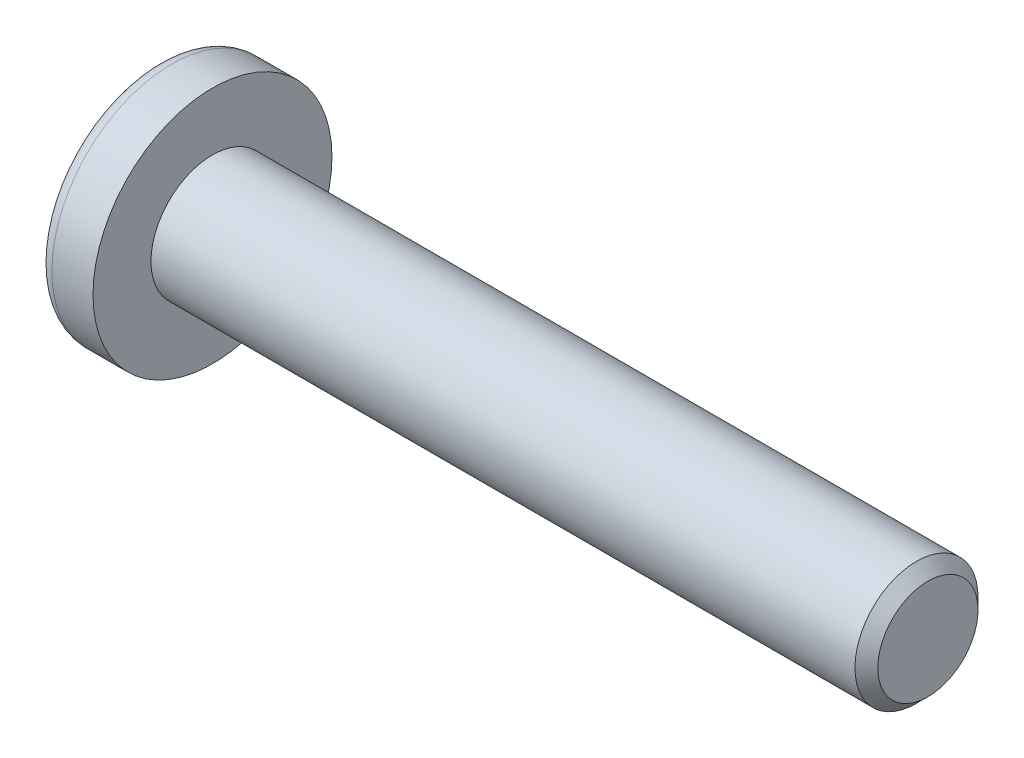
ISO-10303-21;
HEADER;
FILE_DESCRIPTION(('STEP AP214'),'2;1');
FILE_NAME('part.step','',(''),(''),'','','');
FILE_SCHEMA(('AUTOMOTIVE_DESIGN { 1 0 10303 214 1 1 1 1 }'));
ENDSEC;
DATA;
#1=APPLICATION_CONTEXT('core data for automotive mechanical design processes');
#2=APPLICATION_PROTOCOL_DEFINITION('international standard','automotive_design',2000,#1);
#3=PRODUCT_CONTEXT('',#1,'mechanical');
#4=PRODUCT('Part','Part','',(#3));
#5=PRODUCT_RELATED_PRODUCT_CATEGORY('part','',(#4));
#6=PRODUCT_DEFINITION_FORMATION('','',#4);
#7=PRODUCT_DEFINITION_CONTEXT('part definition',#1,'design');
#8=PRODUCT_DEFINITION('design','',#6,#7);
#9=PRODUCT_DEFINITION_SHAPE('','',#8);
#10=(LENGTH_UNIT() NAMED_UNIT(*) SI_UNIT(.MILLI.,.METRE.));
#11=(NAMED_UNIT(*) PLANE_ANGLE_UNIT() SI_UNIT($,.RADIAN.));
#12=(NAMED_UNIT(*) SI_UNIT($,.STERADIAN.) SOLID_ANGLE_UNIT());
#13=UNCERTAINTY_MEASURE_WITH_UNIT(LENGTH_MEASURE(1.E-05),#10,'distance_accuracy_value','');
#14=(GEOMETRIC_REPRESENTATION_CONTEXT(3) GLOBAL_UNCERTAINTY_ASSIGNED_CONTEXT((#13)) GLOBAL_UNIT_ASSIGNED_CONTEXT((#10,
#11,#12)) REPRESENTATION_CONTEXT('',''));
#15=CARTESIAN_POINT('',(0.,0.,0.));
#16=DIRECTION('',(0.,0.,1.));
#17=DIRECTION('',(1.,0.,0.));
#18=AXIS2_PLACEMENT_3D('',#15,#16,#17);
#19=CARTESIAN_POINT('',(3.49504,0.,0.));
#20=DIRECTION('',(-1.,0.,0.));
#21=DIRECTION('',(0.,1.,0.));
#22=AXIS2_PLACEMENT_3D('',#19,#20,#21);
#23=SPHERICAL_SURFACE('',#22,3.49504);
#24=CARTESIAN_POINT('',(0.638066947960321,0.,0.));
#25=DIRECTION('',(-1.,0.,0.));
#26=DIRECTION('',(0.,0.,1.));
#27=AXIS2_PLACEMENT_3D('',#24,#25,#26);
#28=CIRCLE('',#27,2.01320877742947);
#29=CARTESIAN_POINT('',(0.638066947960321,0.,2.01320877742947));
#30=VERTEX_POINT('',#29);
#31=EDGE_CURVE('E135',#30,#30,#28,.T.);
#32=ORIENTED_EDGE('',*,*,#31,.T.);
#33=EDGE_LOOP('',(#32));
#34=FACE_BOUND('',#33,.T.);
#35=CARTESIAN_POINT('',(3.48860800425343,-0.0562204072662827,0.));
#36=DIRECTION('',(-0.113665320353011,-0.99351909641891,0.));
#37=DIRECTION('',(0.99351909641891,-0.113665320353011,0.));
#38=AXIS2_PLACEMENT_3D('',#35,#36,#37);
#39=CIRCLE('',#38,3.49458187725478);
#40=CARTESIAN_POINT('',(0.227775025036725,0.316840992898337,1.19995665346604));
#41=VERTEX_POINT('',#40);
#42=CARTESIAN_POINT('',(0.033060362162214,0.339117670430593,0.339117670430593));
#43=VERTEX_POINT('',#42);
#44=EDGE_CURVE('E131',#41,#43,#39,.T.);
#45=ORIENTED_EDGE('',*,*,#44,.F.);
#46=CARTESIAN_POINT('',(2.78874832810788,0.,-0.872695468934767));
#47=DIRECTION('',(0.629103472698606,0.,0.777321568360582));
#48=DIRECTION('',(0.777321568360582,0.,-0.629103472698606));
#49=AXIS2_PLACEMENT_3D('',#46,#47,#48);
#50=CIRCLE('',#49,3.30981257691679);
#51=CARTESIAN_POINT('',(0.227775025036724,-0.316840992898345,1.19995665346604));
#52=VERTEX_POINT('',#51);
#53=EDGE_CURVE('E123',#41,#52,#50,.T.);
#54=ORIENTED_EDGE('',*,*,#53,.T.);
#55=CARTESIAN_POINT('',(3.48860800425343,0.0562204072662818,0.));
#56=DIRECTION('',(-0.11366532035301,0.99351909641891,0.));
#57=DIRECTION('',(-0.99351909641891,-0.11366532035301,0.));
#58=AXIS2_PLACEMENT_3D('',#55,#56,#57);
#59=CIRCLE('',#58,3.49458187725478);
#60=CARTESIAN_POINT('',(0.0330603621622127,-0.339117670430595,0.339117670430594));
#61=VERTEX_POINT('',#60);
#62=EDGE_CURVE('E374',#61,#52,#59,.T.);
#63=ORIENTED_EDGE('',*,*,#62,.F.);
#64=CARTESIAN_POINT('',(3.48860800425343,0.,-0.0562204072662819));
#65=DIRECTION('',(-0.11366532035301,0.,-0.99351909641891));
#66=DIRECTION('',(-0.99351909641891,0.,0.11366532035301));
#67=AXIS2_PLACEMENT_3D('',#64,#65,#66);
#68=CIRCLE('',#67,3.49458187725478);
#69=CARTESIAN_POINT('',(0.227775025036724,-1.19995665346604,0.316840992898341));
#70=VERTEX_POINT('',#69);
#71=EDGE_CURVE('E169',#70,#61,#68,.T.);
#72=ORIENTED_EDGE('',*,*,#71,.F.);
#73=CARTESIAN_POINT('',(2.78874832810788,0.872695468934764,0.));
#74=DIRECTION('',(0.629103472698606,-0.777321568360582,0.));
#75=DIRECTION('',(0.777321568360582,0.629103472698606,0.));
#76=AXIS2_PLACEMENT_3D('',#73,#74,#75);
#77=CIRCLE('',#76,3.30981257691679);
#78=CARTESIAN_POINT('',(0.227775025036722,-1.19995665346604,-0.316840992898341));
#79=VERTEX_POINT('',#78);
#80=EDGE_CURVE('E165',#70,#79,#77,.T.);
#81=ORIENTED_EDGE('',*,*,#80,.T.);
#82=CARTESIAN_POINT('',(3.48860800425343,0.,0.0562204072662826));
#83=DIRECTION('',(-0.113665320353011,0.,0.99351909641891));
#84=DIRECTION('',(0.99351909641891,0.,0.113665320353011));
#85=AXIS2_PLACEMENT_3D('',#82,#83,#84);
#86=CIRCLE('',#85,3.49458187725478);
#87=CARTESIAN_POINT('',(0.0330603621622127,-0.339117670430592,-0.339117670430594));
#88=VERTEX_POINT('',#87);
#89=EDGE_CURVE('E49',#88,#79,#86,.T.);
#90=ORIENTED_EDGE('',*,*,#89,.F.);
#91=CARTESIAN_POINT('',(0.227775025036724,-0.316840992898336,-1.19995665346604));
#92=VERTEX_POINT('',#91);
#93=EDGE_CURVE('E372',#92,#88,#59,.T.);
#94=ORIENTED_EDGE('',*,*,#93,.F.);
#95=CARTESIAN_POINT('',(2.78874832810788,0.,0.872695468934766));
#96=DIRECTION('',(0.629103472698606,0.,-0.777321568360582));
#97=DIRECTION('',(-0.777321568360582,0.,-0.629103472698606));
#98=AXIS2_PLACEMENT_3D('',#95,#96,#97);
#99=CIRCLE('',#98,3.30981257691679);
#100=CARTESIAN_POINT('',(0.227775025036724,0.316840992898345,-1.19995665346604));
#101=VERTEX_POINT('',#100);
#102=EDGE_CURVE('E379',#92,#101,#99,.T.);
#103=ORIENTED_EDGE('',*,*,#102,.T.);
#104=CARTESIAN_POINT('',(0.033060362162214,0.339117670430595,-0.339117670430594));
#105=VERTEX_POINT('',#104);
#106=EDGE_CURVE('E108',#105,#101,#39,.T.);
#107=ORIENTED_EDGE('',*,*,#106,.F.);
#108=CARTESIAN_POINT('',(0.227775025036726,1.19995665346604,-0.316840992898341));
#109=VERTEX_POINT('',#108);
#110=EDGE_CURVE('E130',#109,#105,#86,.T.);
#111=ORIENTED_EDGE('',*,*,#110,.F.);
#112=CARTESIAN_POINT('',(2.78874832810788,-0.872695468934769,0.));
#113=DIRECTION('',(0.629103472698606,0.777321568360582,0.));
#114=DIRECTION('',(-0.777321568360582,0.629103472698606,0.));
#115=AXIS2_PLACEMENT_3D('',#112,#113,#114);
#116=CIRCLE('',#115,3.30981257691679);
#117=CARTESIAN_POINT('',(0.227775025036726,1.19995665346604,0.31684099289834));
#118=VERTEX_POINT('',#117);
#119=EDGE_CURVE('E57',#109,#118,#116,.T.);
#120=ORIENTED_EDGE('',*,*,#119,.T.);
#121=EDGE_CURVE('E168',#43,#118,#68,.T.);
#122=ORIENTED_EDGE('',*,*,#121,.F.);
#123=EDGE_LOOP('',(#45,#54,#63,#72,#81,#90,#94,#103,#107,#111,#120,#122));
#124=FACE_BOUND('',#123,.T.);
#125=ADVANCED_FACE('F34',(#34,#124),#23,.T.);
#126=CARTESIAN_POINT('',(1.71044397905759,0.,-0.147213612565445));
#127=DIRECTION('',(-0.113665320353011,0.,0.99351909641891));
#128=DIRECTION('',(0.99351909641891,0.,0.113665320353011));
#129=AXIS2_PLACEMENT_3D('',#126,#127,#128);
#130=PLANE('',#129);
#131=ORIENTED_EDGE('',*,*,#110,.T.);
#132=DIRECTION('',(0.987162587649563,-0.112938092654823,0.112938092654823));
#133=VECTOR('',#132,1.);
#134=CARTESIAN_POINT('',(1.72685656853982,0.145335901056886,-0.145335901056885));
#135=LINE('',#134,#133);
#136=CARTESIAN_POINT('',(1.4986,0.171450000000001,-0.17145));
#137=VERTEX_POINT('',#136);
#138=EDGE_CURVE('E106',#105,#137,#135,.T.);
#139=ORIENTED_EDGE('',*,*,#138,.T.);
#140=DIRECTION('',(0.774265880811046,-0.626630437436058,0.0885812660249925));
#141=VECTOR('',#140,1.);
#142=CARTESIAN_POINT('',(0.,1.3843,-0.3429));
#143=LINE('',#142,#141);
#144=EDGE_CURVE('E128',#109,#137,#143,.T.);
#145=ORIENTED_EDGE('',*,*,#144,.F.);
#146=EDGE_LOOP('',(#131,#139,#145));
#147=FACE_BOUND('',#146,.T.);
#148=ADVANCED_FACE('F127',(#147),#130,.T.);
#149=DIRECTION('',(0.774265880811046,0.626630437436058,0.0885812660249925));
#150=VECTOR('',#149,1.);
#151=CARTESIAN_POINT('',(0.,-1.3843,-0.3429));
#152=LINE('',#151,#150);
#153=CARTESIAN_POINT('',(1.4986,-0.17145,-0.17145));
#154=VERTEX_POINT('',#153);
#155=EDGE_CURVE('E150',#79,#154,#152,.T.);
#156=ORIENTED_EDGE('',*,*,#155,.T.);
#157=DIRECTION('',(-0.987162587649563,-0.112938092654822,-0.112938092654823));
#158=VECTOR('',#157,1.);
#159=CARTESIAN_POINT('',(1.72685656853982,-0.145335901056885,-0.145335901056885));
#160=LINE('',#159,#158);
#161=EDGE_CURVE('E363',#154,#88,#160,.T.);
#162=ORIENTED_EDGE('',*,*,#161,.T.);
#163=ORIENTED_EDGE('',*,*,#89,.T.);
#164=EDGE_LOOP('',(#156,#162,#163));
#165=FACE_BOUND('',#164,.T.);
#166=ADVANCED_FACE('F198',(#165),#130,.T.);
#167=CARTESIAN_POINT('',(1.71044397905759,0.,0.147213612565445));
#168=DIRECTION('',(-0.11366532035301,0.,-0.99351909641891));
#169=DIRECTION('',(-0.99351909641891,0.,0.11366532035301));
#170=AXIS2_PLACEMENT_3D('',#167,#168,#169);
#171=PLANE('',#170);
#172=DIRECTION('',(0.774265880811046,-0.626630437436058,-0.0885812660249922));
#173=VECTOR('',#172,1.);
#174=CARTESIAN_POINT('',(0.,1.3843,0.342899999999999));
#175=LINE('',#174,#173);
#176=CARTESIAN_POINT('',(1.4986,0.17145,0.17145));
#177=VERTEX_POINT('',#176);
#178=EDGE_CURVE('E136',#118,#177,#175,.T.);
#179=ORIENTED_EDGE('',*,*,#178,.T.);
#180=DIRECTION('',(-0.987162587649563,0.112938092654822,0.112938092654822));
#181=VECTOR('',#180,1.);
#182=CARTESIAN_POINT('',(1.72685656853981,0.145335901056885,0.145335901056886));
#183=LINE('',#182,#181);
#184=EDGE_CURVE('E369',#177,#43,#183,.T.);
#185=ORIENTED_EDGE('',*,*,#184,.T.);
#186=ORIENTED_EDGE('',*,*,#121,.T.);
#187=EDGE_LOOP('',(#179,#185,#186));
#188=FACE_BOUND('',#187,.T.);
#189=ADVANCED_FACE('F229',(#188),#171,.T.);
#190=ORIENTED_EDGE('',*,*,#71,.T.);
#191=DIRECTION('',(0.987162587649563,0.112938092654823,-0.112938092654822));
#192=VECTOR('',#191,1.);
#193=CARTESIAN_POINT('',(1.72685656853982,-0.145335901056886,0.145335901056886));
#194=LINE('',#193,#192);
#195=CARTESIAN_POINT('',(1.4986,-0.171450000000001,0.171449999999999));
#196=VERTEX_POINT('',#195);
#197=EDGE_CURVE('E376',#61,#196,#194,.T.);
#198=ORIENTED_EDGE('',*,*,#197,.T.);
#199=DIRECTION('',(0.774265880811046,0.626630437436058,-0.0885812660249922));
#200=VECTOR('',#199,1.);
#201=CARTESIAN_POINT('',(0.,-1.3843,0.342899999999999));
#202=LINE('',#201,#200);
#203=EDGE_CURVE('E147',#70,#196,#202,.T.);
#204=ORIENTED_EDGE('',*,*,#203,.F.);
#205=EDGE_LOOP('',(#190,#198,#204));
#206=FACE_BOUND('',#205,.T.);
#207=ADVANCED_FACE('F218',(#206),#171,.T.);
#208=CARTESIAN_POINT('',(-25.4,0.,0.));
#209=DIRECTION('',(-1.,0.,0.));
#210=DIRECTION('',(0.,0.,1.));
#211=AXIS2_PLACEMENT_3D('',#208,#209,#210);
#212=CYLINDRICAL_SURFACE('',#211,1.0922);
#213=CARTESIAN_POINT('',(14.0716,0.,0.));
#214=DIRECTION('',(1.,0.,0.));
#215=DIRECTION('',(0.,0.,-1.));
#216=AXIS2_PLACEMENT_3D('',#213,#214,#215);
#217=CIRCLE('',#216,1.0922);
#218=CARTESIAN_POINT('',(14.0716,0.,-1.0922));
#219=VERTEX_POINT('',#218);
#220=EDGE_CURVE('E42',#219,#219,#217,.F.);
#221=ORIENTED_EDGE('',*,*,#220,.T.);
#222=EDGE_LOOP('',(#221));
#223=FACE_BOUND('',#222,.T.);
#224=CARTESIAN_POINT('',(1.5748,0.,0.));
#225=DIRECTION('',(-1.,0.,0.));
#226=DIRECTION('',(0.,0.,1.));
#227=AXIS2_PLACEMENT_3D('',#224,#225,#226);
#228=CIRCLE('',#227,1.0922);
#229=CARTESIAN_POINT('',(1.5748,0.,1.0922));
#230=VERTEX_POINT('',#229);
#231=EDGE_CURVE('E162',#230,#230,#228,.T.);
#232=ORIENTED_EDGE('',*,*,#231,.F.);
#233=EDGE_LOOP('',(#232));
#234=FACE_BOUND('',#233,.T.);
#235=ADVANCED_FACE('F36',(#223,#234),#212,.T.);
#236=CARTESIAN_POINT('',(1.5748,1.0922,0.));
#237=DIRECTION('',(-1.,0.,0.));
#238=DIRECTION('',(0.,0.,1.));
#239=AXIS2_PLACEMENT_3D('',#236,#237,#238);
#240=PLANE('',#239);
#241=CARTESIAN_POINT('',(1.5748,0.,0.));
#242=DIRECTION('',(-1.,0.,0.));
#243=DIRECTION('',(0.,0.,1.));
#244=AXIS2_PLACEMENT_3D('',#241,#242,#243);
#245=CIRCLE('',#244,2.1209);
#246=CARTESIAN_POINT('',(1.5748,0.,2.1209));
#247=VERTEX_POINT('',#246);
#248=EDGE_CURVE('E159',#247,#247,#245,.T.);
#249=ORIENTED_EDGE('',*,*,#248,.F.);
#250=EDGE_LOOP('',(#249));
#251=FACE_BOUND('',#250,.T.);
#252=ORIENTED_EDGE('',*,*,#231,.T.);
#253=EDGE_LOOP('',(#252));
#254=FACE_BOUND('',#253,.T.);
#255=ADVANCED_FACE('F211',(#251,#254),#240,.F.);
#256=CARTESIAN_POINT('',(-25.4,0.,0.));
#257=DIRECTION('',(-1.,0.,0.));
#258=DIRECTION('',(0.,0.,1.));
#259=AXIS2_PLACEMENT_3D('',#256,#257,#258);
#260=CYLINDRICAL_SURFACE('',#259,2.1209);
#261=ORIENTED_EDGE('',*,*,#248,.T.);
#262=EDGE_LOOP('',(#261));
#263=FACE_BOUND('',#262,.T.);
#264=CARTESIAN_POINT('',(0.845695803486458,0.,0.));
#265=DIRECTION('',(-1.,0.,0.));
#266=DIRECTION('',(0.,0.,1.));
#267=AXIS2_PLACEMENT_3D('',#264,#265,#266);
#268=CIRCLE('',#267,2.1209);
#269=CARTESIAN_POINT('',(0.845695803486458,0.,2.1209));
#270=VERTEX_POINT('',#269);
#271=EDGE_CURVE('E156',#270,#270,#268,.T.);
#272=ORIENTED_EDGE('',*,*,#271,.F.);
#273=EDGE_LOOP('',(#272));
#274=FACE_BOUND('',#273,.T.);
#275=ADVANCED_FACE('F208',(#263,#274),#260,.T.);
#276=CARTESIAN_POINT('',(0.845695803486459,0.,0.));
#277=DIRECTION('',(-1.,0.,0.));
#278=DIRECTION('',(0.,0.,1.));
#279=AXIS2_PLACEMENT_3D('',#276,#277,#278);
#280=TOROIDAL_SURFACE('',#279,1.8669,0.254000000000001);
#281=ORIENTED_EDGE('',*,*,#271,.T.);
#282=EDGE_LOOP('',(#281));
#283=FACE_BOUND('',#282,.T.);
#284=ORIENTED_EDGE('',*,*,#31,.F.);
#285=EDGE_LOOP('',(#284));
#286=FACE_BOUND('',#285,.T.);
#287=ADVANCED_FACE('F205',(#283,#286),#280,.T.);
#288=CARTESIAN_POINT('',(14.2748,1.0922,0.));
#289=DIRECTION('',(1.,0.,0.));
#290=DIRECTION('',(0.,0.,-1.));
#291=AXIS2_PLACEMENT_3D('',#288,#289,#290);
#292=PLANE('',#291);
#293=CARTESIAN_POINT('',(14.2748,0.,0.));
#294=DIRECTION('',(1.,0.,0.));
#295=DIRECTION('',(0.,0.,-1.));
#296=AXIS2_PLACEMENT_3D('',#293,#294,#295);
#297=CIRCLE('',#296,0.889000000000001);
#298=CARTESIAN_POINT('',(14.2748,0.,-0.889000000000001));
#299=VERTEX_POINT('',#298);
#300=EDGE_CURVE('E11',#299,#299,#297,.T.);
#301=ORIENTED_EDGE('',*,*,#300,.T.);
#302=EDGE_LOOP('',(#301));
#303=FACE_BOUND('',#302,.T.);
#304=ADVANCED_FACE('F203',(#303),#292,.T.);
#305=CARTESIAN_POINT('',(1.4986,0.17145,0.17145));
#306=DIRECTION('',(0.629103472698606,0.777321568360582,0.));
#307=DIRECTION('',(-0.777321568360582,0.629103472698606,0.));
#308=AXIS2_PLACEMENT_3D('',#305,#306,#307);
#309=PLANE('',#308);
#310=ORIENTED_EDGE('',*,*,#144,.T.);
#311=DIRECTION('',(0.,0.,-1.));
#312=VECTOR('',#311,1.);
#313=CARTESIAN_POINT('',(1.4986,0.17145,0.17145));
#314=LINE('',#313,#312);
#315=EDGE_CURVE('E122',#177,#137,#314,.T.);
#316=ORIENTED_EDGE('',*,*,#315,.F.);
#317=ORIENTED_EDGE('',*,*,#178,.F.);
#318=ORIENTED_EDGE('',*,*,#119,.F.);
#319=EDGE_LOOP('',(#310,#316,#317,#318));
#320=FACE_BOUND('',#319,.T.);
#321=ADVANCED_FACE('F134',(#320),#309,.F.);
#322=CARTESIAN_POINT('',(0.,-1.3843,-0.3429));
#323=DIRECTION('',(0.629103472698606,-0.777321568360582,0.));
#324=DIRECTION('',(0.777321568360582,0.629103472698606,0.));
#325=AXIS2_PLACEMENT_3D('',#322,#323,#324);
#326=PLANE('',#325);
#327=ORIENTED_EDGE('',*,*,#203,.T.);
#328=DIRECTION('',(0.,0.,1.));
#329=VECTOR('',#328,1.);
#330=CARTESIAN_POINT('',(1.4986,-0.17145,-0.17145));
#331=LINE('',#330,#329);
#332=EDGE_CURVE('E143',#154,#196,#331,.T.);
#333=ORIENTED_EDGE('',*,*,#332,.F.);
#334=ORIENTED_EDGE('',*,*,#155,.F.);
#335=ORIENTED_EDGE('',*,*,#80,.F.);
#336=EDGE_LOOP('',(#327,#333,#334,#335));
#337=FACE_BOUND('',#336,.T.);
#338=ADVANCED_FACE('F237',(#337),#326,.F.);
#339=CARTESIAN_POINT('',(1.4986,0.17145,-0.17145));
#340=DIRECTION('',(-1.,0.,0.));
#341=DIRECTION('',(0.,0.,1.));
#342=AXIS2_PLACEMENT_3D('',#339,#340,#341);
#343=PLANE('',#342);
#344=DIRECTION('',(0.,1.,0.));
#345=VECTOR('',#344,1.);
#346=CARTESIAN_POINT('',(1.4986,-0.17145,-0.17145));
#347=LINE('',#346,#345);
#348=EDGE_CURVE('E115',#154,#137,#347,.T.);
#349=ORIENTED_EDGE('',*,*,#348,.F.);
#350=ORIENTED_EDGE('',*,*,#332,.T.);
#351=DIRECTION('',(0.,-1.,0.));
#352=VECTOR('',#351,1.);
#353=CARTESIAN_POINT('',(1.4986,0.17145,0.17145));
#354=LINE('',#353,#352);
#355=EDGE_CURVE('E141',#177,#196,#354,.T.);
#356=ORIENTED_EDGE('',*,*,#355,.F.);
#357=ORIENTED_EDGE('',*,*,#315,.T.);
#358=EDGE_LOOP('',(#349,#350,#356,#357));
#359=FACE_BOUND('',#358,.T.);
#360=ADVANCED_FACE('F139',(#359),#343,.T.);
#361=CARTESIAN_POINT('',(0.,0.342900000000005,-1.3843));
#362=DIRECTION('',(0.629103472698606,0.,-0.777321568360582));
#363=DIRECTION('',(0.777321568360582,0.,0.629103472698606));
#364=AXIS2_PLACEMENT_3D('',#361,#362,#363);
#365=PLANE('',#364);
#366=DIRECTION('',(0.774265880811046,0.08858126602499,0.626630437436058));
#367=VECTOR('',#366,1.);
#368=CARTESIAN_POINT('',(0.,-0.342899999999994,-1.3843));
#369=LINE('',#368,#367);
#370=EDGE_CURVE('E112',#92,#154,#369,.T.);
#371=ORIENTED_EDGE('',*,*,#370,.T.);
#372=ORIENTED_EDGE('',*,*,#348,.T.);
#373=DIRECTION('',(0.774265880811046,-0.0885812660249947,0.626630437436057));
#374=VECTOR('',#373,1.);
#375=CARTESIAN_POINT('',(0.,0.342900000000005,-1.3843));
#376=LINE('',#375,#374);
#377=EDGE_CURVE('E102',#101,#137,#376,.T.);
#378=ORIENTED_EDGE('',*,*,#377,.F.);
#379=ORIENTED_EDGE('',*,*,#102,.F.);
#380=EDGE_LOOP('',(#371,#372,#378,#379));
#381=FACE_BOUND('',#380,.T.);
#382=ADVANCED_FACE('F116',(#381),#365,.F.);
#383=CARTESIAN_POINT('',(1.71044397905759,-0.147213612565445,0.));
#384=DIRECTION('',(-0.11366532035301,0.99351909641891,0.));
#385=DIRECTION('',(-0.99351909641891,-0.11366532035301,0.));
#386=AXIS2_PLACEMENT_3D('',#383,#384,#385);
#387=PLANE('',#386);
#388=ORIENTED_EDGE('',*,*,#93,.T.);
#389=ORIENTED_EDGE('',*,*,#161,.F.);
#390=ORIENTED_EDGE('',*,*,#370,.F.);
#391=EDGE_LOOP('',(#388,#389,#390));
#392=FACE_BOUND('',#391,.T.);
#393=ADVANCED_FACE('F189',(#392),#387,.T.);
#394=CARTESIAN_POINT('',(1.71044397905759,0.147213612565445,0.));
#395=DIRECTION('',(-0.113665320353011,-0.99351909641891,0.));
#396=DIRECTION('',(0.99351909641891,-0.113665320353011,0.));
#397=AXIS2_PLACEMENT_3D('',#394,#395,#396);
#398=PLANE('',#397);
#399=ORIENTED_EDGE('',*,*,#106,.T.);
#400=ORIENTED_EDGE('',*,*,#377,.T.);
#401=ORIENTED_EDGE('',*,*,#138,.F.);
#402=EDGE_LOOP('',(#399,#400,#401));
#403=FACE_BOUND('',#402,.T.);
#404=ADVANCED_FACE('F104',(#403),#398,.T.);
#405=CARTESIAN_POINT('',(1.4986,-0.171450000000001,0.171449999999999));
#406=DIRECTION('',(0.629103472698606,0.,0.777321568360582));
#407=DIRECTION('',(-0.777321568360582,0.,0.629103472698606));
#408=AXIS2_PLACEMENT_3D('',#405,#406,#407);
#409=PLANE('',#408);
#410=DIRECTION('',(0.774265880811046,-0.0885812660249903,-0.626630437436058));
#411=VECTOR('',#410,1.);
#412=CARTESIAN_POINT('',(0.,0.342899999999995,1.3843));
#413=LINE('',#412,#411);
#414=EDGE_CURVE('E381',#41,#177,#413,.T.);
#415=ORIENTED_EDGE('',*,*,#414,.T.);
#416=ORIENTED_EDGE('',*,*,#355,.T.);
#417=DIRECTION('',(0.774265880811046,0.0885812660249944,-0.626630437436058));
#418=VECTOR('',#417,1.);
#419=CARTESIAN_POINT('',(0.,-0.342900000000004,1.3843));
#420=LINE('',#419,#418);
#421=EDGE_CURVE('E111',#52,#196,#420,.T.);
#422=ORIENTED_EDGE('',*,*,#421,.F.);
#423=ORIENTED_EDGE('',*,*,#53,.F.);
#424=EDGE_LOOP('',(#415,#416,#422,#423));
#425=FACE_BOUND('',#424,.T.);
#426=ADVANCED_FACE('F282',(#425),#409,.F.);
#427=ORIENTED_EDGE('',*,*,#44,.T.);
#428=ORIENTED_EDGE('',*,*,#184,.F.);
#429=ORIENTED_EDGE('',*,*,#414,.F.);
#430=EDGE_LOOP('',(#427,#428,#429));
#431=FACE_BOUND('',#430,.T.);
#432=ADVANCED_FACE('F186',(#431),#398,.T.);
#433=ORIENTED_EDGE('',*,*,#62,.T.);
#434=ORIENTED_EDGE('',*,*,#421,.T.);
#435=ORIENTED_EDGE('',*,*,#197,.F.);
#436=EDGE_LOOP('',(#433,#434,#435));
#437=FACE_BOUND('',#436,.T.);
#438=ADVANCED_FACE('F180',(#437),#387,.T.);
#439=CARTESIAN_POINT('',(14.0716,0.,0.));
#440=DIRECTION('',(-1.,0.,0.));
#441=DIRECTION('',(0.,0.,1.));
#442=AXIS2_PLACEMENT_3D('',#439,#440,#441);
#443=CONICAL_SURFACE('',#442,1.0922,0.785398163397444);
#444=ORIENTED_EDGE('',*,*,#300,.F.);
#445=EDGE_LOOP('',(#444));
#446=FACE_BOUND('',#445,.T.);
#447=ORIENTED_EDGE('',*,*,#220,.F.);
#448=EDGE_LOOP('',(#447));
#449=FACE_BOUND('',#448,.T.);
#450=ADVANCED_FACE('F178',(#446,#449),#443,.T.);
#451=CLOSED_SHELL('',(#125,#148,#166,#189,#207,#235,#255,#275,#287,#304,#321,#338,#360,#382,
#393,#404,#426,#432,#438,#450));
#452=MANIFOLD_SOLID_BREP('B2',#451);
#453=ADVANCED_BREP_SHAPE_REPRESENTATION('',(#18,#452),#14);
#454=SHAPE_DEFINITION_REPRESENTATION(#9,#453);
ENDSEC;
END-ISO-10303-21;
